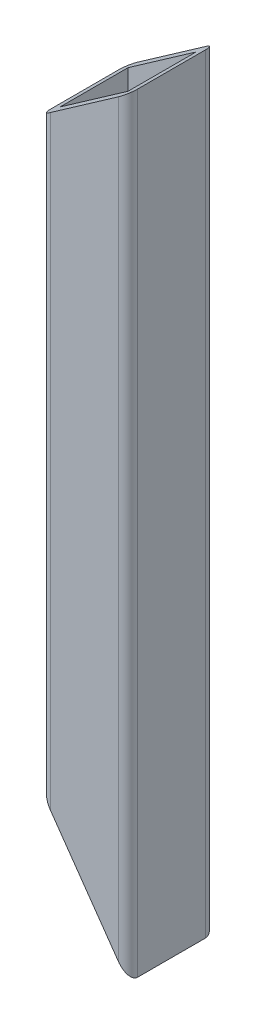
ISO-10303-21;
HEADER;
FILE_DESCRIPTION(('STEP AP214'),'2;1');
FILE_NAME('part.step','',(''),(''),'','','');
FILE_SCHEMA(('AUTOMOTIVE_DESIGN { 1 0 10303 214 1 1 1 1 }'));
ENDSEC;
DATA;
#1=APPLICATION_CONTEXT('core data for automotive mechanical design processes');
#2=APPLICATION_PROTOCOL_DEFINITION('international standard','automotive_design',2000,#1);
#3=PRODUCT_CONTEXT('',#1,'mechanical');
#4=PRODUCT('Part','Part','',(#3));
#5=PRODUCT_RELATED_PRODUCT_CATEGORY('part','',(#4));
#6=PRODUCT_DEFINITION_FORMATION('','',#4);
#7=PRODUCT_DEFINITION_CONTEXT('part definition',#1,'design');
#8=PRODUCT_DEFINITION('design','',#6,#7);
#9=PRODUCT_DEFINITION_SHAPE('','',#8);
#10=(LENGTH_UNIT() NAMED_UNIT(*) SI_UNIT(.MILLI.,.METRE.));
#11=(NAMED_UNIT(*) PLANE_ANGLE_UNIT() SI_UNIT($,.RADIAN.));
#12=(NAMED_UNIT(*) SI_UNIT($,.STERADIAN.) SOLID_ANGLE_UNIT());
#13=UNCERTAINTY_MEASURE_WITH_UNIT(LENGTH_MEASURE(1.E-05),#10,'distance_accuracy_value','');
#14=(GEOMETRIC_REPRESENTATION_CONTEXT(3) GLOBAL_UNCERTAINTY_ASSIGNED_CONTEXT((#13)) GLOBAL_UNIT_ASSIGNED_CONTEXT((#10,
#11,#12)) REPRESENTATION_CONTEXT('',''));
#15=CARTESIAN_POINT('',(0.,0.,0.));
#16=DIRECTION('',(0.,0.,1.));
#17=DIRECTION('',(1.,0.,0.));
#18=AXIS2_PLACEMENT_3D('',#15,#16,#17);
#19=CARTESIAN_POINT('',(22.8,226.,2.8));
#20=DIRECTION('',(0.,-1.,0.));
#21=DIRECTION('',(0.,0.,-1.));
#22=AXIS2_PLACEMENT_3D('',#19,#20,#21);
#23=CYLINDRICAL_SURFACE('',#22,2.8);
#24=DIRECTION('',(0.,-1.,0.));
#25=VECTOR('',#24,1.);
#26=CARTESIAN_POINT('',(22.8,226.,0.));
#27=LINE('',#26,#25);
#28=CARTESIAN_POINT('',(22.8,224.039418893013,0.));
#29=VERTEX_POINT('',#28);
#30=CARTESIAN_POINT('',(22.8,4.27275481642145,0.));
#31=VERTEX_POINT('',#30);
#32=EDGE_CURVE('E41',#29,#31,#27,.T.);
#33=ORIENTED_EDGE('',*,*,#32,.F.);
#34=CARTESIAN_POINT('',(22.8,224.039418893013,2.8));
#35=DIRECTION('',(0.573576436351041,-0.819152044288995,0.));
#36=DIRECTION('',(-0.819152044288995,-0.573576436351041,0.));
#37=AXIS2_PLACEMENT_3D('',#34,#35,#36);
#38=ELLIPSE('',#37,3.41816884853206,2.8);
#39=CARTESIAN_POINT('',(25.6,226.,2.80000000000002));
#40=VERTEX_POINT('',#39);
#41=EDGE_CURVE('E137',#29,#40,#38,.T.);
#42=ORIENTED_EDGE('',*,*,#41,.T.);
#43=DIRECTION('',(0.,-1.,0.));
#44=VECTOR('',#43,1.);
#45=CARTESIAN_POINT('',(25.6,226.,2.80000000000002));
#46=LINE('',#45,#44);
#47=CARTESIAN_POINT('',(25.6,0.277953650721696,2.80000000000002));
#48=VERTEX_POINT('',#47);
#49=EDGE_CURVE('E123',#40,#48,#46,.T.);
#50=ORIENTED_EDGE('',*,*,#49,.T.);
#51=CARTESIAN_POINT('',(22.8,4.27275481642142,2.8));
#52=DIRECTION('',(-0.818881305016617,-0.573962898011956,0.));
#53=DIRECTION('',(0.573962898011956,-0.818881305016617,0.));
#54=AXIS2_PLACEMENT_3D('',#51,#52,#53);
#55=ELLIPSE('',#54,4.87836410628353,2.8);
#56=EDGE_CURVE('E167',#31,#48,#55,.T.);
#57=ORIENTED_EDGE('',*,*,#56,.F.);
#58=EDGE_LOOP('',(#33,#42,#50,#57));
#59=FACE_BOUND('',#58,.T.);
#60=ADVANCED_FACE('F34',(#59),#23,.T.);
#61=CARTESIAN_POINT('',(2.80000000000002,226.,0.));
#62=DIRECTION('',(0.,0.,1.));
#63=DIRECTION('',(1.,0.,0.));
#64=AXIS2_PLACEMENT_3D('',#61,#62,#63);
#65=PLANE('',#64);
#66=DIRECTION('',(0.,-1.,0.));
#67=VECTOR('',#66,1.);
#68=CARTESIAN_POINT('',(2.80000000000002,226.,0.));
#69=LINE('',#68,#67);
#70=CARTESIAN_POINT('',(2.80000000000002,210.035268128819,0.));
#71=VERTEX_POINT('',#70);
#72=CARTESIAN_POINT('',(2.80000000000002,32.8070488571334,0.));
#73=VERTEX_POINT('',#72);
#74=EDGE_CURVE('E161',#71,#73,#69,.T.);
#75=ORIENTED_EDGE('',*,*,#74,.F.);
#76=DIRECTION('',(0.819152044288995,0.573576436351041,0.));
#77=VECTOR('',#76,1.);
#78=CARTESIAN_POINT('',(10.3009703660873,215.287504123041,0.));
#79=LINE('',#78,#77);
#80=EDGE_CURVE('E48',#71,#29,#79,.T.);
#81=ORIENTED_EDGE('',*,*,#80,.T.);
#82=ORIENTED_EDGE('',*,*,#32,.T.);
#83=DIRECTION('',(0.573962898011956,-0.818881305016617,0.));
#84=VECTOR('',#83,1.);
#85=CARTESIAN_POINT('',(-88.0021334641077,162.355787646575,0.));
#86=LINE('',#85,#84);
#87=EDGE_CURVE('E165',#73,#31,#86,.T.);
#88=ORIENTED_EDGE('',*,*,#87,.F.);
#89=EDGE_LOOP('',(#75,#81,#82,#88));
#90=FACE_BOUND('',#89,.T.);
#91=ADVANCED_FACE('F163',(#90),#65,.F.);
#92=CARTESIAN_POINT('',(2.8,226.,2.8));
#93=DIRECTION('',(0.,-1.,0.));
#94=DIRECTION('',(0.,0.,-1.));
#95=AXIS2_PLACEMENT_3D('',#92,#93,#94);
#96=CYLINDRICAL_SURFACE('',#95,2.8);
#97=DIRECTION('',(0.,-1.,0.));
#98=VECTOR('',#97,1.);
#99=CARTESIAN_POINT('',(0.,226.,2.80000000000002));
#100=LINE('',#99,#98);
#101=CARTESIAN_POINT('',(0.,208.074687021832,2.80000000000002));
#102=VERTEX_POINT('',#101);
#103=CARTESIAN_POINT('',(0.,36.8018500228331,2.80000000000002));
#104=VERTEX_POINT('',#103);
#105=EDGE_CURVE('E159',#102,#104,#100,.T.);
#106=ORIENTED_EDGE('',*,*,#105,.F.);
#107=CARTESIAN_POINT('',(2.8,210.035268128819,2.8));
#108=DIRECTION('',(0.573576436351041,-0.819152044288995,0.));
#109=DIRECTION('',(-0.819152044288995,-0.573576436351041,0.));
#110=AXIS2_PLACEMENT_3D('',#107,#108,#109);
#111=ELLIPSE('',#110,3.41816884853206,2.8);
#112=EDGE_CURVE('E56',#102,#71,#111,.T.);
#113=ORIENTED_EDGE('',*,*,#112,.T.);
#114=ORIENTED_EDGE('',*,*,#74,.T.);
#115=CARTESIAN_POINT('',(2.8,32.8070488571334,2.8));
#116=DIRECTION('',(-0.818881305016617,-0.573962898011956,0.));
#117=DIRECTION('',(0.573962898011956,-0.818881305016617,0.));
#118=AXIS2_PLACEMENT_3D('',#115,#116,#117);
#119=ELLIPSE('',#118,4.87836410628353,2.8);
#120=EDGE_CURVE('E174',#104,#73,#119,.T.);
#121=ORIENTED_EDGE('',*,*,#120,.F.);
#122=EDGE_LOOP('',(#106,#113,#114,#121));
#123=FACE_BOUND('',#122,.T.);
#124=ADVANCED_FACE('F229',(#123),#96,.T.);
#125=CARTESIAN_POINT('',(0.,226.,2.80000000000002));
#126=DIRECTION('',(1.,0.,0.));
#127=DIRECTION('',(0.,0.,-1.));
#128=AXIS2_PLACEMENT_3D('',#125,#126,#127);
#129=PLANE('',#128);
#130=DIRECTION('',(0.,-1.,0.));
#131=VECTOR('',#130,1.);
#132=CARTESIAN_POINT('',(0.,226.,22.8));
#133=LINE('',#132,#131);
#134=CARTESIAN_POINT('',(0.,208.074687021832,22.8));
#135=VERTEX_POINT('',#134);
#136=CARTESIAN_POINT('',(0.,36.8018500228331,22.8));
#137=VERTEX_POINT('',#136);
#138=EDGE_CURVE('E157',#135,#137,#133,.T.);
#139=ORIENTED_EDGE('',*,*,#138,.F.);
#140=DIRECTION('',(0.,0.,-1.));
#141=VECTOR('',#140,1.);
#142=CARTESIAN_POINT('',(0.,208.074687021832,343.358754809306));
#143=LINE('',#142,#141);
#144=EDGE_CURVE('E228',#135,#102,#143,.T.);
#145=ORIENTED_EDGE('',*,*,#144,.T.);
#146=ORIENTED_EDGE('',*,*,#105,.T.);
#147=DIRECTION('',(0.,0.,-1.));
#148=VECTOR('',#147,1.);
#149=CARTESIAN_POINT('',(0.,36.8018500228331,343.701817540539));
#150=LINE('',#149,#148);
#151=EDGE_CURVE('E139',#137,#104,#150,.T.);
#152=ORIENTED_EDGE('',*,*,#151,.F.);
#153=EDGE_LOOP('',(#139,#145,#146,#152));
#154=FACE_BOUND('',#153,.T.);
#155=ADVANCED_FACE('F227',(#154),#129,.F.);
#156=CARTESIAN_POINT('',(2.8,226.,22.8));
#157=DIRECTION('',(0.,-1.,0.));
#158=DIRECTION('',(0.,0.,-1.));
#159=AXIS2_PLACEMENT_3D('',#156,#157,#158);
#160=CYLINDRICAL_SURFACE('',#159,2.8);
#161=DIRECTION('',(0.,-1.,0.));
#162=VECTOR('',#161,1.);
#163=CARTESIAN_POINT('',(2.80000000000002,226.,25.6));
#164=LINE('',#163,#162);
#165=CARTESIAN_POINT('',(2.80000000000002,210.035268128819,25.6));
#166=VERTEX_POINT('',#165);
#167=CARTESIAN_POINT('',(2.80000000000003,32.8070488571334,25.6));
#168=VERTEX_POINT('',#167);
#169=EDGE_CURVE('E155',#166,#168,#164,.T.);
#170=ORIENTED_EDGE('',*,*,#169,.F.);
#171=CARTESIAN_POINT('',(2.8,210.035268128819,22.8));
#172=DIRECTION('',(0.573576436351041,-0.819152044288995,0.));
#173=DIRECTION('',(-0.819152044288995,-0.573576436351041,0.));
#174=AXIS2_PLACEMENT_3D('',#171,#172,#173);
#175=ELLIPSE('',#174,3.41816884853206,2.8);
#176=EDGE_CURVE('E224',#166,#135,#175,.T.);
#177=ORIENTED_EDGE('',*,*,#176,.T.);
#178=ORIENTED_EDGE('',*,*,#138,.T.);
#179=CARTESIAN_POINT('',(2.8,32.8070488571334,22.8));
#180=DIRECTION('',(-0.818881305016617,-0.573962898011956,0.));
#181=DIRECTION('',(0.573962898011956,-0.818881305016617,0.));
#182=AXIS2_PLACEMENT_3D('',#179,#180,#181);
#183=ELLIPSE('',#182,4.87836410628353,2.8);
#184=EDGE_CURVE('E169',#168,#137,#183,.T.);
#185=ORIENTED_EDGE('',*,*,#184,.F.);
#186=EDGE_LOOP('',(#170,#177,#178,#185));
#187=FACE_BOUND('',#186,.T.);
#188=ADVANCED_FACE('F221',(#187),#160,.T.);
#189=CARTESIAN_POINT('',(2.80000000000002,226.,25.6));
#190=DIRECTION('',(0.,0.,-1.));
#191=DIRECTION('',(-1.,0.,0.));
#192=AXIS2_PLACEMENT_3D('',#189,#190,#191);
#193=PLANE('',#192);
#194=DIRECTION('',(0.,-1.,0.));
#195=VECTOR('',#194,1.);
#196=CARTESIAN_POINT('',(22.8,226.,25.6));
#197=LINE('',#196,#195);
#198=CARTESIAN_POINT('',(22.8,224.039418893013,25.6));
#199=VERTEX_POINT('',#198);
#200=CARTESIAN_POINT('',(22.8,4.27275481642145,25.6));
#201=VERTEX_POINT('',#200);
#202=EDGE_CURVE('E153',#199,#201,#197,.T.);
#203=ORIENTED_EDGE('',*,*,#202,.F.);
#204=DIRECTION('',(-0.819152044288995,-0.573576436351041,0.));
#205=VECTOR('',#204,1.);
#206=CARTESIAN_POINT('',(10.3009703660873,215.287504123041,25.6));
#207=LINE('',#206,#205);
#208=EDGE_CURVE('E234',#199,#166,#207,.T.);
#209=ORIENTED_EDGE('',*,*,#208,.T.);
#210=ORIENTED_EDGE('',*,*,#169,.T.);
#211=DIRECTION('',(-0.573962898011956,0.818881305016617,0.));
#212=VECTOR('',#211,1.);
#213=CARTESIAN_POINT('',(-88.0021334641077,162.355787646575,25.6));
#214=LINE('',#213,#212);
#215=EDGE_CURVE('E213',#201,#168,#214,.T.);
#216=ORIENTED_EDGE('',*,*,#215,.F.);
#217=EDGE_LOOP('',(#203,#209,#210,#216));
#218=FACE_BOUND('',#217,.T.);
#219=ADVANCED_FACE('F271',(#218),#193,.F.);
#220=CARTESIAN_POINT('',(22.8,226.,22.8));
#221=DIRECTION('',(0.,-1.,0.));
#222=DIRECTION('',(0.,0.,-1.));
#223=AXIS2_PLACEMENT_3D('',#220,#221,#222);
#224=CYLINDRICAL_SURFACE('',#223,2.8);
#225=DIRECTION('',(0.,-1.,0.));
#226=VECTOR('',#225,1.);
#227=CARTESIAN_POINT('',(25.6,226.,22.8));
#228=LINE('',#227,#226);
#229=CARTESIAN_POINT('',(25.6,226.,22.8));
#230=VERTEX_POINT('',#229);
#231=CARTESIAN_POINT('',(25.6,0.277953650721691,22.8));
#232=VERTEX_POINT('',#231);
#233=EDGE_CURVE('E134',#230,#232,#228,.T.);
#234=ORIENTED_EDGE('',*,*,#233,.F.);
#235=CARTESIAN_POINT('',(22.8,224.039418893013,22.8));
#236=DIRECTION('',(0.573576436351041,-0.819152044288995,0.));
#237=DIRECTION('',(-0.819152044288995,-0.573576436351041,0.));
#238=AXIS2_PLACEMENT_3D('',#235,#236,#237);
#239=ELLIPSE('',#238,3.41816884853206,2.8);
#240=EDGE_CURVE('E143',#230,#199,#239,.T.);
#241=ORIENTED_EDGE('',*,*,#240,.T.);
#242=ORIENTED_EDGE('',*,*,#202,.T.);
#243=CARTESIAN_POINT('',(22.8,4.27275481642142,22.8));
#244=DIRECTION('',(-0.818881305016617,-0.573962898011956,0.));
#245=DIRECTION('',(0.573962898011956,-0.818881305016617,0.));
#246=AXIS2_PLACEMENT_3D('',#243,#244,#245);
#247=ELLIPSE('',#246,4.87836410628353,2.8);
#248=EDGE_CURVE('E210',#232,#201,#247,.T.);
#249=ORIENTED_EDGE('',*,*,#248,.F.);
#250=EDGE_LOOP('',(#234,#241,#242,#249));
#251=FACE_BOUND('',#250,.T.);
#252=ADVANCED_FACE('F274',(#251),#224,.T.);
#253=CARTESIAN_POINT('',(25.6,226.,2.80000000000002));
#254=DIRECTION('',(-1.,0.,0.));
#255=DIRECTION('',(0.,0.,1.));
#256=AXIS2_PLACEMENT_3D('',#253,#254,#255);
#257=PLANE('',#256);
#258=DIRECTION('',(0.,0.,1.));
#259=VECTOR('',#258,1.);
#260=CARTESIAN_POINT('',(25.6,0.277953650721696,2.79999999999996));
#261=LINE('',#260,#259);
#262=EDGE_CURVE('E130',#48,#232,#261,.T.);
#263=ORIENTED_EDGE('',*,*,#262,.F.);
#264=ORIENTED_EDGE('',*,*,#49,.F.);
#265=DIRECTION('',(0.,0.,-1.));
#266=VECTOR('',#265,1.);
#267=CARTESIAN_POINT('',(25.6,226.,2.80000000000002));
#268=LINE('',#267,#266);
#269=EDGE_CURVE('E127',#230,#40,#268,.T.);
#270=ORIENTED_EDGE('',*,*,#269,.F.);
#271=ORIENTED_EDGE('',*,*,#233,.T.);
#272=EDGE_LOOP('',(#263,#264,#270,#271));
#273=FACE_BOUND('',#272,.T.);
#274=ADVANCED_FACE('F125',(#273),#257,.F.);
#275=CARTESIAN_POINT('',(22.8,226.,2.8));
#276=DIRECTION('',(1.,0.,0.));
#277=DIRECTION('',(0.,0.,-1.));
#278=AXIS2_PLACEMENT_3D('',#275,#276,#277);
#279=PLANE('',#278);
#280=DIRECTION('',(0.,-1.,0.));
#281=VECTOR('',#280,1.);
#282=CARTESIAN_POINT('',(22.8,226.,22.8));
#283=LINE('',#282,#281);
#284=CARTESIAN_POINT('',(22.8,224.039418893013,22.8));
#285=VERTEX_POINT('',#284);
#286=CARTESIAN_POINT('',(22.8,4.27275481642142,22.8));
#287=VERTEX_POINT('',#286);
#288=EDGE_CURVE('E149',#285,#287,#283,.T.);
#289=ORIENTED_EDGE('',*,*,#288,.F.);
#290=DIRECTION('',(0.,0.,-1.));
#291=VECTOR('',#290,1.);
#292=CARTESIAN_POINT('',(22.8,224.039418893013,2.8));
#293=LINE('',#292,#291);
#294=CARTESIAN_POINT('',(22.8,224.039418893013,2.8));
#295=VERTEX_POINT('',#294);
#296=EDGE_CURVE('E237',#285,#295,#293,.T.);
#297=ORIENTED_EDGE('',*,*,#296,.T.);
#298=DIRECTION('',(0.,-1.,0.));
#299=VECTOR('',#298,1.);
#300=CARTESIAN_POINT('',(22.8,226.,2.8));
#301=LINE('',#300,#299);
#302=CARTESIAN_POINT('',(22.8,4.27275481642138,2.8));
#303=VERTEX_POINT('',#302);
#304=EDGE_CURVE('E144',#295,#303,#301,.T.);
#305=ORIENTED_EDGE('',*,*,#304,.T.);
#306=DIRECTION('',(0.,0.,-1.));
#307=VECTOR('',#306,1.);
#308=CARTESIAN_POINT('',(22.8,4.27275481642142,2.80000000000011));
#309=LINE('',#308,#307);
#310=EDGE_CURVE('E195',#287,#303,#309,.T.);
#311=ORIENTED_EDGE('',*,*,#310,.F.);
#312=EDGE_LOOP('',(#289,#297,#305,#311));
#313=FACE_BOUND('',#312,.T.);
#314=ADVANCED_FACE('F196',(#313),#279,.F.);
#315=CARTESIAN_POINT('',(2.8,226.,2.8));
#316=DIRECTION('',(0.,0.,-1.));
#317=DIRECTION('',(-1.,0.,0.));
#318=AXIS2_PLACEMENT_3D('',#315,#316,#317);
#319=PLANE('',#318);
#320=ORIENTED_EDGE('',*,*,#304,.F.);
#321=DIRECTION('',(-0.819152044288995,-0.573576436351041,0.));
#322=VECTOR('',#321,1.);
#323=CARTESIAN_POINT('',(10.3009703660873,215.287504123041,2.8));
#324=LINE('',#323,#322);
#325=CARTESIAN_POINT('',(2.8,210.035268128819,2.8));
#326=VERTEX_POINT('',#325);
#327=EDGE_CURVE('E239',#295,#326,#324,.T.);
#328=ORIENTED_EDGE('',*,*,#327,.T.);
#329=DIRECTION('',(0.,-1.,0.));
#330=VECTOR('',#329,1.);
#331=CARTESIAN_POINT('',(2.8,226.,2.8));
#332=LINE('',#331,#330);
#333=CARTESIAN_POINT('',(2.8,32.8070488571334,2.8));
#334=VERTEX_POINT('',#333);
#335=EDGE_CURVE('E146',#326,#334,#332,.T.);
#336=ORIENTED_EDGE('',*,*,#335,.T.);
#337=DIRECTION('',(-0.573962898011956,0.818881305016617,0.));
#338=VECTOR('',#337,1.);
#339=CARTESIAN_POINT('',(-88.0021334641077,162.355787646575,2.79999999999998));
#340=LINE('',#339,#338);
#341=EDGE_CURVE('E201',#303,#334,#340,.T.);
#342=ORIENTED_EDGE('',*,*,#341,.F.);
#343=EDGE_LOOP('',(#320,#328,#336,#342));
#344=FACE_BOUND('',#343,.T.);
#345=ADVANCED_FACE('F248',(#344),#319,.F.);
#346=CARTESIAN_POINT('',(2.8,226.,2.8));
#347=DIRECTION('',(-1.,0.,0.));
#348=DIRECTION('',(0.,0.,1.));
#349=AXIS2_PLACEMENT_3D('',#346,#347,#348);
#350=PLANE('',#349);
#351=ORIENTED_EDGE('',*,*,#335,.F.);
#352=DIRECTION('',(0.,0.,1.));
#353=VECTOR('',#352,1.);
#354=CARTESIAN_POINT('',(2.8,210.035268128819,2.79999999999999));
#355=LINE('',#354,#353);
#356=CARTESIAN_POINT('',(2.8,210.035268128819,22.8));
#357=VERTEX_POINT('',#356);
#358=EDGE_CURVE('E242',#326,#357,#355,.T.);
#359=ORIENTED_EDGE('',*,*,#358,.T.);
#360=DIRECTION('',(0.,-1.,0.));
#361=VECTOR('',#360,1.);
#362=CARTESIAN_POINT('',(2.8,226.,22.8));
#363=LINE('',#362,#361);
#364=CARTESIAN_POINT('',(2.79999999999999,32.8070488571334,22.8));
#365=VERTEX_POINT('',#364);
#366=EDGE_CURVE('E179',#357,#365,#363,.T.);
#367=ORIENTED_EDGE('',*,*,#366,.T.);
#368=DIRECTION('',(0.,0.,1.));
#369=VECTOR('',#368,1.);
#370=CARTESIAN_POINT('',(2.8,32.8070488571334,2.80000000000009));
#371=LINE('',#370,#369);
#372=EDGE_CURVE('E203',#334,#365,#371,.T.);
#373=ORIENTED_EDGE('',*,*,#372,.F.);
#374=EDGE_LOOP('',(#351,#359,#367,#373));
#375=FACE_BOUND('',#374,.T.);
#376=ADVANCED_FACE('F245',(#375),#350,.F.);
#377=CARTESIAN_POINT('',(2.8,226.,22.8));
#378=DIRECTION('',(0.,0.,1.));
#379=DIRECTION('',(1.,0.,0.));
#380=AXIS2_PLACEMENT_3D('',#377,#378,#379);
#381=PLANE('',#380);
#382=ORIENTED_EDGE('',*,*,#366,.F.);
#383=DIRECTION('',(0.819152044288995,0.573576436351041,0.));
#384=VECTOR('',#383,1.);
#385=CARTESIAN_POINT('',(10.3009703660873,215.287504123041,22.8));
#386=LINE('',#385,#384);
#387=EDGE_CURVE('E191',#357,#285,#386,.T.);
#388=ORIENTED_EDGE('',*,*,#387,.T.);
#389=ORIENTED_EDGE('',*,*,#288,.T.);
#390=DIRECTION('',(0.573962898011956,-0.818881305016617,0.));
#391=VECTOR('',#390,1.);
#392=CARTESIAN_POINT('',(-88.0021334641077,162.355787646575,22.8));
#393=LINE('',#392,#391);
#394=EDGE_CURVE('E11',#365,#287,#393,.T.);
#395=ORIENTED_EDGE('',*,*,#394,.F.);
#396=EDGE_LOOP('',(#382,#388,#389,#395));
#397=FACE_BOUND('',#396,.T.);
#398=ADVANCED_FACE('F189',(#397),#381,.F.);
#399=CARTESIAN_POINT('',(25.794820765725,0.,343.701817540539));
#400=DIRECTION('',(-0.818881305016617,-0.573962898011956,0.));
#401=DIRECTION('',(0.573962898011956,-0.818881305016617,0.));
#402=AXIS2_PLACEMENT_3D('',#399,#400,#401);
#403=PLANE('',#402);
#404=ORIENTED_EDGE('',*,*,#394,.T.);
#405=ORIENTED_EDGE('',*,*,#310,.T.);
#406=ORIENTED_EDGE('',*,*,#341,.T.);
#407=ORIENTED_EDGE('',*,*,#372,.T.);
#408=EDGE_LOOP('',(#404,#405,#406,#407));
#409=FACE_BOUND('',#408,.T.);
#410=ORIENTED_EDGE('',*,*,#151,.T.);
#411=ORIENTED_EDGE('',*,*,#120,.T.);
#412=ORIENTED_EDGE('',*,*,#87,.T.);
#413=ORIENTED_EDGE('',*,*,#56,.T.);
#414=ORIENTED_EDGE('',*,*,#262,.T.);
#415=ORIENTED_EDGE('',*,*,#248,.T.);
#416=ORIENTED_EDGE('',*,*,#215,.T.);
#417=ORIENTED_EDGE('',*,*,#184,.T.);
#418=EDGE_LOOP('',(#410,#411,#412,#413,#414,#415,#416,#417));
#419=FACE_BOUND('',#418,.T.);
#420=ADVANCED_FACE('F172',(#409,#419),#403,.T.);
#421=CARTESIAN_POINT('',(25.6,226.,343.358754809306));
#422=DIRECTION('',(0.573576436351041,-0.819152044288995,0.));
#423=DIRECTION('',(0.819152044288995,0.573576436351041,0.));
#424=AXIS2_PLACEMENT_3D('',#421,#422,#423);
#425=PLANE('',#424);
#426=ORIENTED_EDGE('',*,*,#296,.F.);
#427=ORIENTED_EDGE('',*,*,#387,.F.);
#428=ORIENTED_EDGE('',*,*,#358,.F.);
#429=ORIENTED_EDGE('',*,*,#327,.F.);
#430=EDGE_LOOP('',(#426,#427,#428,#429));
#431=FACE_BOUND('',#430,.T.);
#432=ORIENTED_EDGE('',*,*,#41,.F.);
#433=ORIENTED_EDGE('',*,*,#80,.F.);
#434=ORIENTED_EDGE('',*,*,#112,.F.);
#435=ORIENTED_EDGE('',*,*,#144,.F.);
#436=ORIENTED_EDGE('',*,*,#176,.F.);
#437=ORIENTED_EDGE('',*,*,#208,.F.);
#438=ORIENTED_EDGE('',*,*,#240,.F.);
#439=ORIENTED_EDGE('',*,*,#269,.T.);
#440=EDGE_LOOP('',(#432,#433,#434,#435,#436,#437,#438,#439));
#441=FACE_BOUND('',#440,.T.);
#442=ADVANCED_FACE('F141',(#431,#441),#425,.F.);
#443=CLOSED_SHELL('',(#60,#91,#124,#155,#188,#219,#252,#274,#314,#345,#376,#398,#420,#442));
#444=MANIFOLD_SOLID_BREP('B2',#443);
#445=ADVANCED_BREP_SHAPE_REPRESENTATION('',(#18,#444),#14);
#446=SHAPE_DEFINITION_REPRESENTATION(#9,#445);
ENDSEC;
END-ISO-10303-21;
